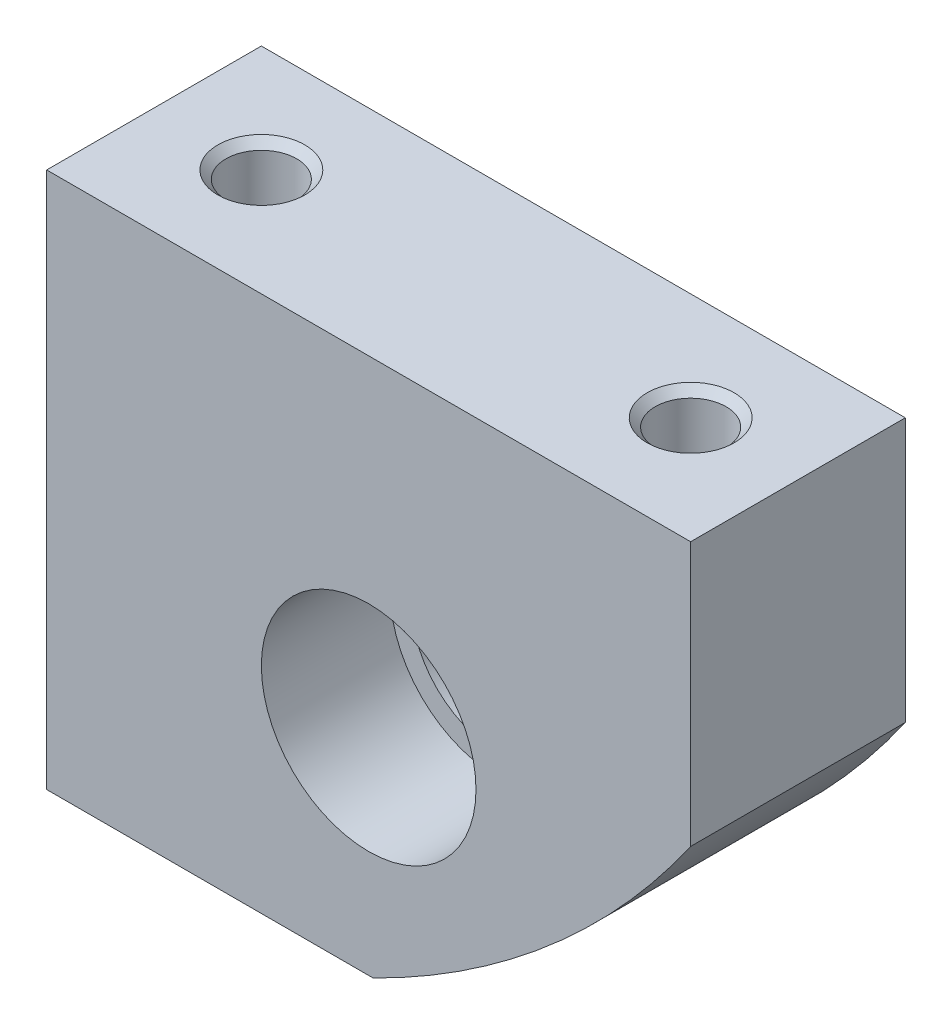
ISO-10303-21;
HEADER;
FILE_DESCRIPTION(('STEP AP214'),'2;1');
FILE_NAME('part.step','',(''),(''),'','','');
FILE_SCHEMA(('AUTOMOTIVE_DESIGN { 1 0 10303 214 1 1 1 1 }'));
ENDSEC;
DATA;
#1=APPLICATION_CONTEXT('core data for automotive mechanical design processes');
#2=APPLICATION_PROTOCOL_DEFINITION('international standard','automotive_design',2000,#1);
#3=PRODUCT_CONTEXT('',#1,'mechanical');
#4=PRODUCT('Part','Part','',(#3));
#5=PRODUCT_RELATED_PRODUCT_CATEGORY('part','',(#4));
#6=PRODUCT_DEFINITION_FORMATION('','',#4);
#7=PRODUCT_DEFINITION_CONTEXT('part definition',#1,'design');
#8=PRODUCT_DEFINITION('design','',#6,#7);
#9=PRODUCT_DEFINITION_SHAPE('','',#8);
#10=(LENGTH_UNIT() NAMED_UNIT(*) SI_UNIT(.MILLI.,.METRE.));
#11=(NAMED_UNIT(*) PLANE_ANGLE_UNIT() SI_UNIT($,.RADIAN.));
#12=(NAMED_UNIT(*) SI_UNIT($,.STERADIAN.) SOLID_ANGLE_UNIT());
#13=UNCERTAINTY_MEASURE_WITH_UNIT(LENGTH_MEASURE(1.E-05),#10,'distance_accuracy_value','');
#14=(GEOMETRIC_REPRESENTATION_CONTEXT(3) GLOBAL_UNCERTAINTY_ASSIGNED_CONTEXT((#13)) GLOBAL_UNIT_ASSIGNED_CONTEXT((#10,
#11,#12)) REPRESENTATION_CONTEXT('',''));
#15=CARTESIAN_POINT('',(0.,0.,0.));
#16=DIRECTION('',(0.,0.,1.));
#17=DIRECTION('',(1.,0.,0.));
#18=AXIS2_PLACEMENT_3D('',#15,#16,#17);
#19=CARTESIAN_POINT('',(0.,0.,10.));
#20=DIRECTION('',(0.,0.,1.));
#21=DIRECTION('',(1.,0.,0.));
#22=AXIS2_PLACEMENT_3D('',#19,#20,#21);
#23=PLANE('',#22);
#24=CARTESIAN_POINT('',(-3.88573926585701,5.14084507042254,10.));
#25=DIRECTION('',(0.,0.,1.));
#26=DIRECTION('',(1.,0.,0.));
#27=AXIS2_PLACEMENT_3D('',#24,#25,#26);
#28=CIRCLE('',#27,5.);
#29=CARTESIAN_POINT('',(1.11426073414299,5.14084507042254,10.));
#30=VERTEX_POINT('',#29);
#31=EDGE_CURVE('E156',#30,#30,#28,.T.);
#32=ORIENTED_EDGE('',*,*,#31,.F.);
#33=EDGE_LOOP('',(#32));
#34=FACE_BOUND('',#33,.T.);
#35=DIRECTION('',(1.,0.,0.));
#36=VECTOR('',#35,1.);
#37=CARTESIAN_POINT('',(-18.885739265857,-4.85915492957746,10.));
#38=LINE('',#37,#36);
#39=CARTESIAN_POINT('',(-18.885739265857,-4.85915492957746,10.));
#40=VERTEX_POINT('',#39);
#41=CARTESIAN_POINT('',(-3.68108873177176,-4.85915492957746,10.));
#42=VERTEX_POINT('',#41);
#43=EDGE_CURVE('E85',#40,#42,#38,.T.);
#44=ORIENTED_EDGE('',*,*,#43,.T.);
#45=CARTESIAN_POINT('',(-20.885739265857,30.1408450704225,10.));
#46=DIRECTION('',(0.,0.,1.));
#47=DIRECTION('',(1.,0.,0.));
#48=AXIS2_PLACEMENT_3D('',#45,#46,#47);
#49=CIRCLE('',#48,39.);
#50=CARTESIAN_POINT('',(11.114260734143,7.84734826081459,10.));
#51=VERTEX_POINT('',#50);
#52=EDGE_CURVE('E95',#42,#51,#49,.T.);
#53=ORIENTED_EDGE('',*,*,#52,.T.);
#54=DIRECTION('',(0.,1.,0.));
#55=VECTOR('',#54,1.);
#56=CARTESIAN_POINT('',(11.114260734143,20.1408450704225,10.));
#57=LINE('',#56,#55);
#58=CARTESIAN_POINT('',(11.114260734143,20.1408450704225,10.));
#59=VERTEX_POINT('',#58);
#60=EDGE_CURVE('E167',#51,#59,#57,.T.);
#61=ORIENTED_EDGE('',*,*,#60,.T.);
#62=DIRECTION('',(-1.,0.,0.));
#63=VECTOR('',#62,1.);
#64=CARTESIAN_POINT('',(-18.885739265857,20.1408450704225,10.));
#65=LINE('',#64,#63);
#66=CARTESIAN_POINT('',(-18.885739265857,20.1408450704225,10.));
#67=VERTEX_POINT('',#66);
#68=EDGE_CURVE('E61',#59,#67,#65,.T.);
#69=ORIENTED_EDGE('',*,*,#68,.T.);
#70=DIRECTION('',(0.,-1.,0.));
#71=VECTOR('',#70,1.);
#72=CARTESIAN_POINT('',(-18.885739265857,20.1408450704225,10.));
#73=LINE('',#72,#71);
#74=EDGE_CURVE('E117',#67,#40,#73,.T.);
#75=ORIENTED_EDGE('',*,*,#74,.T.);
#76=EDGE_LOOP('',(#44,#53,#61,#69,#75));
#77=FACE_BOUND('',#76,.T.);
#78=ADVANCED_FACE('F38',(#34,#77),#23,.T.);
#79=CARTESIAN_POINT('',(0.,0.,0.));
#80=DIRECTION('',(0.,0.,1.));
#81=DIRECTION('',(1.,0.,0.));
#82=AXIS2_PLACEMENT_3D('',#79,#80,#81);
#83=PLANE('',#82);
#84=CARTESIAN_POINT('',(-3.88573926585701,5.14084507042254,0.));
#85=DIRECTION('',(0.,0.,1.));
#86=DIRECTION('',(1.,0.,0.));
#87=AXIS2_PLACEMENT_3D('',#84,#85,#86);
#88=CIRCLE('',#87,4.);
#89=CARTESIAN_POINT('',(0.114260734142991,5.14084507042254,0.));
#90=VERTEX_POINT('',#89);
#91=EDGE_CURVE('E112',#90,#90,#88,.T.);
#92=ORIENTED_EDGE('',*,*,#91,.T.);
#93=EDGE_LOOP('',(#92));
#94=FACE_BOUND('',#93,.T.);
#95=CARTESIAN_POINT('',(-20.885739265857,30.1408450704225,0.));
#96=DIRECTION('',(0.,0.,1.));
#97=DIRECTION('',(1.,0.,0.));
#98=AXIS2_PLACEMENT_3D('',#95,#96,#97);
#99=CIRCLE('',#98,39.);
#100=CARTESIAN_POINT('',(-3.68108873177176,-4.85915492957746,0.));
#101=VERTEX_POINT('',#100);
#102=CARTESIAN_POINT('',(11.114260734143,7.84734826081459,0.));
#103=VERTEX_POINT('',#102);
#104=EDGE_CURVE('E52',#101,#103,#99,.T.);
#105=ORIENTED_EDGE('',*,*,#104,.F.);
#106=DIRECTION('',(1.,0.,0.));
#107=VECTOR('',#106,1.);
#108=CARTESIAN_POINT('',(-18.885739265857,-4.85915492957746,0.));
#109=LINE('',#108,#107);
#110=CARTESIAN_POINT('',(-18.885739265857,-4.85915492957746,0.));
#111=VERTEX_POINT('',#110);
#112=EDGE_CURVE('E103',#111,#101,#109,.T.);
#113=ORIENTED_EDGE('',*,*,#112,.F.);
#114=DIRECTION('',(0.,-1.,0.));
#115=VECTOR('',#114,1.);
#116=CARTESIAN_POINT('',(-18.885739265857,20.1408450704225,0.));
#117=LINE('',#116,#115);
#118=CARTESIAN_POINT('',(-18.885739265857,20.1408450704225,0.));
#119=VERTEX_POINT('',#118);
#120=EDGE_CURVE('E109',#119,#111,#117,.T.);
#121=ORIENTED_EDGE('',*,*,#120,.F.);
#122=DIRECTION('',(-1.,0.,0.));
#123=VECTOR('',#122,1.);
#124=CARTESIAN_POINT('',(-18.885739265857,20.1408450704225,0.));
#125=LINE('',#124,#123);
#126=CARTESIAN_POINT('',(11.114260734143,20.1408450704225,0.));
#127=VERTEX_POINT('',#126);
#128=EDGE_CURVE('E78',#127,#119,#125,.T.);
#129=ORIENTED_EDGE('',*,*,#128,.F.);
#130=DIRECTION('',(0.,1.,0.));
#131=VECTOR('',#130,1.);
#132=CARTESIAN_POINT('',(11.114260734143,20.1408450704225,0.));
#133=LINE('',#132,#131);
#134=EDGE_CURVE('E104',#103,#127,#133,.T.);
#135=ORIENTED_EDGE('',*,*,#134,.F.);
#136=EDGE_LOOP('',(#105,#113,#121,#129,#135));
#137=FACE_BOUND('',#136,.T.);
#138=ADVANCED_FACE('F101',(#94,#137),#83,.F.);
#139=CARTESIAN_POINT('',(-18.885739265857,-4.85915492957746,10.));
#140=DIRECTION('',(0.,1.,0.));
#141=DIRECTION('',(0.,0.,1.));
#142=AXIS2_PLACEMENT_3D('',#139,#140,#141);
#143=PLANE('',#142);
#144=DIRECTION('',(0.,0.,1.));
#145=VECTOR('',#144,1.);
#146=CARTESIAN_POINT('',(-3.68108873177176,-4.85915492957746,0.));
#147=LINE('',#146,#145);
#148=EDGE_CURVE('E92',#42,#101,#147,.F.);
#149=ORIENTED_EDGE('',*,*,#148,.F.);
#150=ORIENTED_EDGE('',*,*,#43,.F.);
#151=DIRECTION('',(0.,0.,-1.));
#152=VECTOR('',#151,1.);
#153=CARTESIAN_POINT('',(-18.885739265857,-4.85915492957746,10.));
#154=LINE('',#153,#152);
#155=EDGE_CURVE('E46',#40,#111,#154,.T.);
#156=ORIENTED_EDGE('',*,*,#155,.T.);
#157=ORIENTED_EDGE('',*,*,#112,.T.);
#158=EDGE_LOOP('',(#149,#150,#156,#157));
#159=FACE_BOUND('',#158,.T.);
#160=ADVANCED_FACE('F106',(#159),#143,.F.);
#161=CARTESIAN_POINT('',(11.114260734143,20.1408450704225,10.));
#162=DIRECTION('',(-1.,0.,0.));
#163=DIRECTION('',(0.,-1.,0.));
#164=AXIS2_PLACEMENT_3D('',#161,#162,#163);
#165=PLANE('',#164);
#166=DIRECTION('',(0.,0.,1.));
#167=VECTOR('',#166,1.);
#168=CARTESIAN_POINT('',(11.114260734143,7.84734826081459,0.));
#169=LINE('',#168,#167);
#170=EDGE_CURVE('E11',#103,#51,#169,.T.);
#171=ORIENTED_EDGE('',*,*,#170,.F.);
#172=ORIENTED_EDGE('',*,*,#134,.T.);
#173=DIRECTION('',(0.,0.,-1.));
#174=VECTOR('',#173,1.);
#175=CARTESIAN_POINT('',(11.114260734143,20.1408450704225,10.));
#176=LINE('',#175,#174);
#177=EDGE_CURVE('E120',#59,#127,#176,.T.);
#178=ORIENTED_EDGE('',*,*,#177,.F.);
#179=ORIENTED_EDGE('',*,*,#60,.F.);
#180=EDGE_LOOP('',(#171,#172,#178,#179));
#181=FACE_BOUND('',#180,.T.);
#182=ADVANCED_FACE('F171',(#181),#165,.F.);
#183=CARTESIAN_POINT('',(-3.88573926585701,5.14084507042254,10.));
#184=DIRECTION('',(0.,0.,-1.));
#185=DIRECTION('',(-1.,0.,0.));
#186=AXIS2_PLACEMENT_3D('',#183,#184,#185);
#187=CYLINDRICAL_SURFACE('',#186,4.);
#188=ORIENTED_EDGE('',*,*,#91,.F.);
#189=EDGE_LOOP('',(#188));
#190=FACE_BOUND('',#189,.T.);
#191=CARTESIAN_POINT('',(-3.88573926585701,5.14084507042254,4.));
#192=DIRECTION('',(0.,0.,1.));
#193=DIRECTION('',(1.,0.,0.));
#194=AXIS2_PLACEMENT_3D('',#191,#192,#193);
#195=CIRCLE('',#194,4.);
#196=CARTESIAN_POINT('',(0.114260734142991,5.14084507042254,4.));
#197=VERTEX_POINT('',#196);
#198=EDGE_CURVE('E123',#197,#197,#195,.T.);
#199=ORIENTED_EDGE('',*,*,#198,.T.);
#200=EDGE_LOOP('',(#199));
#201=FACE_BOUND('',#200,.T.);
#202=ADVANCED_FACE('F176',(#190,#201),#187,.F.);
#203=CARTESIAN_POINT('',(-18.885739265857,20.1408450704225,10.));
#204=DIRECTION('',(1.,0.,0.));
#205=DIRECTION('',(0.,0.,-1.));
#206=AXIS2_PLACEMENT_3D('',#203,#204,#205);
#207=PLANE('',#206);
#208=ORIENTED_EDGE('',*,*,#120,.T.);
#209=ORIENTED_EDGE('',*,*,#155,.F.);
#210=ORIENTED_EDGE('',*,*,#74,.F.);
#211=DIRECTION('',(0.,0.,-1.));
#212=VECTOR('',#211,1.);
#213=CARTESIAN_POINT('',(-18.885739265857,20.1408450704225,10.));
#214=LINE('',#213,#212);
#215=EDGE_CURVE('E118',#67,#119,#214,.T.);
#216=ORIENTED_EDGE('',*,*,#215,.T.);
#217=EDGE_LOOP('',(#208,#209,#210,#216));
#218=FACE_BOUND('',#217,.T.);
#219=ADVANCED_FACE('F40',(#218),#207,.F.);
#220=CARTESIAN_POINT('',(-18.885739265857,20.1408450704225,10.));
#221=DIRECTION('',(0.,-1.,0.));
#222=DIRECTION('',(0.,0.,-1.));
#223=AXIS2_PLACEMENT_3D('',#220,#221,#222);
#224=PLANE('',#223);
#225=CARTESIAN_POINT('',(-13.885739265857,20.1408450704225,5.));
#226=DIRECTION('',(0.,1.,0.));
#227=DIRECTION('',(0.,0.,1.));
#228=AXIS2_PLACEMENT_3D('',#225,#226,#227);
#229=CIRCLE('',#228,2.025);
#230=CARTESIAN_POINT('',(-13.885739265857,20.1408450704225,7.025));
#231=VERTEX_POINT('',#230);
#232=EDGE_CURVE('E97',#231,#231,#229,.T.);
#233=ORIENTED_EDGE('',*,*,#232,.F.);
#234=EDGE_LOOP('',(#233));
#235=FACE_BOUND('',#234,.T.);
#236=CARTESIAN_POINT('',(6.11426073414299,20.1408450704225,5.));
#237=DIRECTION('',(0.,1.,0.));
#238=DIRECTION('',(0.,0.,1.));
#239=AXIS2_PLACEMENT_3D('',#236,#237,#238);
#240=CIRCLE('',#239,2.025);
#241=CARTESIAN_POINT('',(6.11426073414299,20.1408450704225,7.025));
#242=VERTEX_POINT('',#241);
#243=EDGE_CURVE('E133',#242,#242,#240,.T.);
#244=ORIENTED_EDGE('',*,*,#243,.F.);
#245=EDGE_LOOP('',(#244));
#246=FACE_BOUND('',#245,.T.);
#247=ORIENTED_EDGE('',*,*,#128,.T.);
#248=ORIENTED_EDGE('',*,*,#215,.F.);
#249=ORIENTED_EDGE('',*,*,#68,.F.);
#250=ORIENTED_EDGE('',*,*,#177,.T.);
#251=EDGE_LOOP('',(#247,#248,#249,#250));
#252=FACE_BOUND('',#251,.T.);
#253=ADVANCED_FACE('F172',(#235,#246,#252),#224,.F.);
#254=CARTESIAN_POINT('',(-3.88573926585701,5.14084507042254,4.));
#255=DIRECTION('',(0.,0.,1.));
#256=DIRECTION('',(1.,0.,0.));
#257=AXIS2_PLACEMENT_3D('',#254,#255,#256);
#258=CYLINDRICAL_SURFACE('',#257,5.);
#259=CARTESIAN_POINT('',(-3.88573926585701,5.14084507042254,4.));
#260=DIRECTION('',(0.,0.,1.));
#261=DIRECTION('',(1.,0.,0.));
#262=AXIS2_PLACEMENT_3D('',#259,#260,#261);
#263=CIRCLE('',#262,5.);
#264=CARTESIAN_POINT('',(1.11426073414299,5.14084507042254,4.));
#265=VERTEX_POINT('',#264);
#266=EDGE_CURVE('E126',#265,#265,#263,.T.);
#267=ORIENTED_EDGE('',*,*,#266,.F.);
#268=EDGE_LOOP('',(#267));
#269=FACE_BOUND('',#268,.T.);
#270=ORIENTED_EDGE('',*,*,#31,.T.);
#271=EDGE_LOOP('',(#270));
#272=FACE_BOUND('',#271,.T.);
#273=ADVANCED_FACE('F181',(#269,#272),#258,.F.);
#274=CARTESIAN_POINT('',(-3.88573926585701,5.14084507042254,4.));
#275=DIRECTION('',(0.,0.,1.));
#276=DIRECTION('',(1.,0.,0.));
#277=AXIS2_PLACEMENT_3D('',#274,#275,#276);
#278=PLANE('',#277);
#279=ORIENTED_EDGE('',*,*,#198,.F.);
#280=EDGE_LOOP('',(#279));
#281=FACE_BOUND('',#280,.T.);
#282=ORIENTED_EDGE('',*,*,#266,.T.);
#283=EDGE_LOOP('',(#282));
#284=FACE_BOUND('',#283,.T.);
#285=ADVANCED_FACE('F224',(#281,#284),#278,.T.);
#286=CARTESIAN_POINT('',(6.11426073414299,8.64084507042254,5.));
#287=DIRECTION('',(0.,1.,0.));
#288=DIRECTION('',(0.,0.,1.));
#289=AXIS2_PLACEMENT_3D('',#286,#287,#288);
#290=CONICAL_SURFACE('',#289,1.64999999999999,1.02974425867665);
#291=CARTESIAN_POINT('',(6.11426073414299,8.64084507042254,5.));
#292=DIRECTION('',(0.,1.,0.));
#293=DIRECTION('',(0.,0.,1.));
#294=AXIS2_PLACEMENT_3D('',#291,#292,#293);
#295=CIRCLE('',#294,1.64999999999999);
#296=CARTESIAN_POINT('',(6.11426073414299,8.64084507042254,6.64999999999999));
#297=VERTEX_POINT('',#296);
#298=EDGE_CURVE('E130',#297,#297,#295,.T.);
#299=ORIENTED_EDGE('',*,*,#298,.T.);
#300=EDGE_LOOP('',(#299));
#301=FACE_BOUND('',#300,.T.);
#302=CARTESIAN_POINT('',(6.11426073414299,8.25028566805463,5.));
#303=DIRECTION('',(0.,1.,0.));
#304=DIRECTION('',(0.,0.,1.));
#305=AXIS2_PLACEMENT_3D('',#302,#303,#304);
#306=CIRCLE('',#305,1.);
#307=CARTESIAN_POINT('',(6.11426073414299,8.25028566805463,6.));
#308=VERTEX_POINT('',#307);
#309=EDGE_CURVE('E127',#308,#308,#306,.T.);
#310=ORIENTED_EDGE('',*,*,#309,.F.);
#311=EDGE_LOOP('',(#310));
#312=FACE_BOUND('',#311,.T.);
#313=ADVANCED_FACE('F233',(#301,#312),#290,.F.);
#314=CARTESIAN_POINT('',(6.11426073414299,20.1408450704225,5.));
#315=DIRECTION('',(0.,1.,0.));
#316=DIRECTION('',(0.,0.,1.));
#317=AXIS2_PLACEMENT_3D('',#314,#315,#316);
#318=CYLINDRICAL_SURFACE('',#317,1.64999999999999);
#319=ORIENTED_EDGE('',*,*,#298,.F.);
#320=EDGE_LOOP('',(#319));
#321=FACE_BOUND('',#320,.T.);
#322=CARTESIAN_POINT('',(6.11426073414299,19.7658450704225,5.));
#323=DIRECTION('',(0.,1.,0.));
#324=DIRECTION('',(0.,0.,1.));
#325=AXIS2_PLACEMENT_3D('',#322,#323,#324);
#326=CIRCLE('',#325,1.65);
#327=CARTESIAN_POINT('',(6.11426073414299,19.7658450704225,6.65));
#328=VERTEX_POINT('',#327);
#329=EDGE_CURVE('E138',#328,#328,#326,.T.);
#330=ORIENTED_EDGE('',*,*,#329,.T.);
#331=EDGE_LOOP('',(#330));
#332=FACE_BOUND('',#331,.T.);
#333=ADVANCED_FACE('F278',(#321,#332),#318,.F.);
#334=CARTESIAN_POINT('',(6.11426073414299,20.1408450704225,5.));
#335=DIRECTION('',(0.,1.,0.));
#336=DIRECTION('',(0.,0.,1.));
#337=AXIS2_PLACEMENT_3D('',#334,#335,#336);
#338=CONICAL_SURFACE('',#337,2.025,0.785398163397445);
#339=ORIENTED_EDGE('',*,*,#329,.F.);
#340=EDGE_LOOP('',(#339));
#341=FACE_BOUND('',#340,.T.);
#342=ORIENTED_EDGE('',*,*,#243,.T.);
#343=EDGE_LOOP('',(#342));
#344=FACE_BOUND('',#343,.T.);
#345=ADVANCED_FACE('F247',(#341,#344),#338,.F.);
#346=CARTESIAN_POINT('',(6.11426073414299,4.14084507042254,5.));
#347=DIRECTION('',(0.,1.,0.));
#348=DIRECTION('',(0.,0.,1.));
#349=AXIS2_PLACEMENT_3D('',#346,#347,#348);
#350=PLANE('',#349);
#351=CARTESIAN_POINT('',(6.11426073414299,4.14084507042254,5.));
#352=DIRECTION('',(0.,1.,0.));
#353=DIRECTION('',(0.,0.,1.));
#354=AXIS2_PLACEMENT_3D('',#351,#352,#353);
#355=CIRCLE('',#354,1.);
#356=CARTESIAN_POINT('',(6.11426073414299,4.14084507042254,6.));
#357=VERTEX_POINT('',#356);
#358=EDGE_CURVE('E129',#357,#357,#355,.T.);
#359=ORIENTED_EDGE('',*,*,#358,.T.);
#360=EDGE_LOOP('',(#359));
#361=FACE_BOUND('',#360,.T.);
#362=ADVANCED_FACE('F241',(#361),#350,.T.);
#363=CARTESIAN_POINT('',(6.11426073414299,4.14084507042254,5.));
#364=DIRECTION('',(0.,1.,0.));
#365=DIRECTION('',(0.,0.,1.));
#366=AXIS2_PLACEMENT_3D('',#363,#364,#365);
#367=CYLINDRICAL_SURFACE('',#366,1.);
#368=ORIENTED_EDGE('',*,*,#309,.T.);
#369=EDGE_LOOP('',(#368));
#370=FACE_BOUND('',#369,.T.);
#371=ORIENTED_EDGE('',*,*,#358,.F.);
#372=EDGE_LOOP('',(#371));
#373=FACE_BOUND('',#372,.T.);
#374=ADVANCED_FACE('F246',(#370,#373),#367,.F.);
#375=CARTESIAN_POINT('',(-13.885739265857,8.64084507042254,5.));
#376=DIRECTION('',(0.,1.,0.));
#377=DIRECTION('',(0.,0.,1.));
#378=AXIS2_PLACEMENT_3D('',#375,#376,#377);
#379=CONICAL_SURFACE('',#378,1.64999999999999,1.02974425867665);
#380=CARTESIAN_POINT('',(-13.885739265857,8.64084507042254,5.));
#381=DIRECTION('',(0.,1.,0.));
#382=DIRECTION('',(0.,0.,1.));
#383=AXIS2_PLACEMENT_3D('',#380,#381,#382);
#384=CIRCLE('',#383,1.64999999999999);
#385=CARTESIAN_POINT('',(-13.885739265857,8.64084507042254,6.64999999999999));
#386=VERTEX_POINT('',#385);
#387=EDGE_CURVE('E134',#386,#386,#384,.T.);
#388=ORIENTED_EDGE('',*,*,#387,.T.);
#389=EDGE_LOOP('',(#388));
#390=FACE_BOUND('',#389,.T.);
#391=CARTESIAN_POINT('',(-13.885739265857,8.25028566805463,5.));
#392=DIRECTION('',(0.,1.,0.));
#393=DIRECTION('',(0.,0.,1.));
#394=AXIS2_PLACEMENT_3D('',#391,#392,#393);
#395=CIRCLE('',#394,1.);
#396=CARTESIAN_POINT('',(-13.885739265857,8.25028566805463,6.));
#397=VERTEX_POINT('',#396);
#398=EDGE_CURVE('E131',#397,#397,#395,.T.);
#399=ORIENTED_EDGE('',*,*,#398,.F.);
#400=EDGE_LOOP('',(#399));
#401=FACE_BOUND('',#400,.T.);
#402=ADVANCED_FACE('F307',(#390,#401),#379,.F.);
#403=CARTESIAN_POINT('',(-13.885739265857,20.1408450704225,5.));
#404=DIRECTION('',(0.,1.,0.));
#405=DIRECTION('',(0.,0.,1.));
#406=AXIS2_PLACEMENT_3D('',#403,#404,#405);
#407=CYLINDRICAL_SURFACE('',#406,1.64999999999999);
#408=ORIENTED_EDGE('',*,*,#387,.F.);
#409=EDGE_LOOP('',(#408));
#410=FACE_BOUND('',#409,.T.);
#411=CARTESIAN_POINT('',(-13.885739265857,19.7658450704225,5.));
#412=DIRECTION('',(0.,1.,0.));
#413=DIRECTION('',(0.,0.,1.));
#414=AXIS2_PLACEMENT_3D('',#411,#412,#413);
#415=CIRCLE('',#414,1.65);
#416=CARTESIAN_POINT('',(-13.885739265857,19.7658450704225,6.65));
#417=VERTEX_POINT('',#416);
#418=EDGE_CURVE('E141',#417,#417,#415,.T.);
#419=ORIENTED_EDGE('',*,*,#418,.T.);
#420=EDGE_LOOP('',(#419));
#421=FACE_BOUND('',#420,.T.);
#422=ADVANCED_FACE('F316',(#410,#421),#407,.F.);
#423=CARTESIAN_POINT('',(-13.885739265857,20.1408450704225,5.));
#424=DIRECTION('',(0.,1.,0.));
#425=DIRECTION('',(0.,0.,1.));
#426=AXIS2_PLACEMENT_3D('',#423,#424,#425);
#427=CONICAL_SURFACE('',#426,2.025,0.785398163397444);
#428=ORIENTED_EDGE('',*,*,#418,.F.);
#429=EDGE_LOOP('',(#428));
#430=FACE_BOUND('',#429,.T.);
#431=ORIENTED_EDGE('',*,*,#232,.T.);
#432=EDGE_LOOP('',(#431));
#433=FACE_BOUND('',#432,.T.);
#434=ADVANCED_FACE('F262',(#430,#433),#427,.F.);
#435=CARTESIAN_POINT('',(-13.885739265857,4.14084507042254,5.));
#436=DIRECTION('',(0.,1.,0.));
#437=DIRECTION('',(0.,0.,1.));
#438=AXIS2_PLACEMENT_3D('',#435,#436,#437);
#439=PLANE('',#438);
#440=CARTESIAN_POINT('',(-13.885739265857,4.14084507042254,5.));
#441=DIRECTION('',(0.,1.,0.));
#442=DIRECTION('',(0.,0.,1.));
#443=AXIS2_PLACEMENT_3D('',#440,#441,#442);
#444=CIRCLE('',#443,1.);
#445=CARTESIAN_POINT('',(-13.885739265857,4.14084507042254,6.));
#446=VERTEX_POINT('',#445);
#447=EDGE_CURVE('E153',#446,#446,#444,.T.);
#448=ORIENTED_EDGE('',*,*,#447,.T.);
#449=EDGE_LOOP('',(#448));
#450=FACE_BOUND('',#449,.T.);
#451=ADVANCED_FACE('F256',(#450),#439,.T.);
#452=CARTESIAN_POINT('',(-13.885739265857,4.14084507042254,5.));
#453=DIRECTION('',(0.,1.,0.));
#454=DIRECTION('',(0.,0.,1.));
#455=AXIS2_PLACEMENT_3D('',#452,#453,#454);
#456=CYLINDRICAL_SURFACE('',#455,1.);
#457=ORIENTED_EDGE('',*,*,#398,.T.);
#458=EDGE_LOOP('',(#457));
#459=FACE_BOUND('',#458,.T.);
#460=ORIENTED_EDGE('',*,*,#447,.F.);
#461=EDGE_LOOP('',(#460));
#462=FACE_BOUND('',#461,.T.);
#463=ADVANCED_FACE('F261',(#459,#462),#456,.F.);
#464=CARTESIAN_POINT('',(-20.885739265857,30.1408450704225,0.));
#465=DIRECTION('',(0.,0.,1.));
#466=DIRECTION('',(1.,0.,0.));
#467=AXIS2_PLACEMENT_3D('',#464,#465,#466);
#468=CYLINDRICAL_SURFACE('',#467,39.);
#469=ORIENTED_EDGE('',*,*,#148,.T.);
#470=ORIENTED_EDGE('',*,*,#104,.T.);
#471=ORIENTED_EDGE('',*,*,#170,.T.);
#472=ORIENTED_EDGE('',*,*,#52,.F.);
#473=EDGE_LOOP('',(#469,#470,#471,#472));
#474=FACE_BOUND('',#473,.T.);
#475=ADVANCED_FACE('F93',(#474),#468,.T.);
#476=CLOSED_SHELL('',(#78,#138,#160,#182,#202,#219,#253,#273,#285,#313,#333,#345,#362,#374,#402,
#422,#434,#451,#463,#475));
#477=MANIFOLD_SOLID_BREP('B2',#476);
#478=ADVANCED_BREP_SHAPE_REPRESENTATION('',(#18,#477),#14);
#479=SHAPE_DEFINITION_REPRESENTATION(#9,#478);
ENDSEC;
END-ISO-10303-21;
